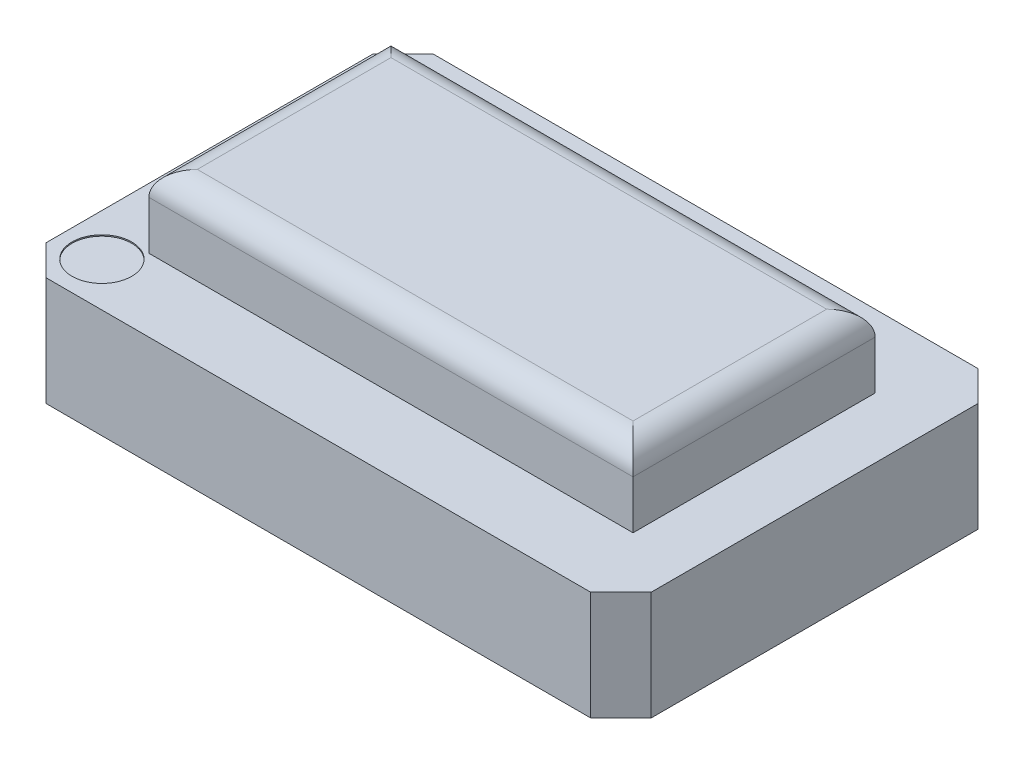
ISO-10303-21;
HEADER;
FILE_DESCRIPTION(('STEP AP214'),'2;1');
FILE_NAME('part.step','',(''),(''),'','','');
FILE_SCHEMA(('AUTOMOTIVE_DESIGN { 1 0 10303 214 1 1 1 1 }'));
ENDSEC;
DATA;
#1=APPLICATION_CONTEXT('core data for automotive mechanical design processes');
#2=APPLICATION_PROTOCOL_DEFINITION('international standard','automotive_design',2000,#1);
#3=PRODUCT_CONTEXT('',#1,'mechanical');
#4=PRODUCT('Part','Part','',(#3));
#5=PRODUCT_RELATED_PRODUCT_CATEGORY('part','',(#4));
#6=PRODUCT_DEFINITION_FORMATION('','',#4);
#7=PRODUCT_DEFINITION_CONTEXT('part definition',#1,'design');
#8=PRODUCT_DEFINITION('design','',#6,#7);
#9=PRODUCT_DEFINITION_SHAPE('','',#8);
#10=(LENGTH_UNIT() NAMED_UNIT(*) SI_UNIT(.MILLI.,.METRE.));
#11=(NAMED_UNIT(*) PLANE_ANGLE_UNIT() SI_UNIT($,.RADIAN.));
#12=(NAMED_UNIT(*) SI_UNIT($,.STERADIAN.) SOLID_ANGLE_UNIT());
#13=UNCERTAINTY_MEASURE_WITH_UNIT(LENGTH_MEASURE(1.E-05),#10,'distance_accuracy_value','');
#14=(GEOMETRIC_REPRESENTATION_CONTEXT(3) GLOBAL_UNCERTAINTY_ASSIGNED_CONTEXT((#13)) GLOBAL_UNIT_ASSIGNED_CONTEXT((#10,
#11,#12)) REPRESENTATION_CONTEXT('',''));
#15=CARTESIAN_POINT('',(0.,0.,0.));
#16=DIRECTION('',(0.,0.,1.));
#17=DIRECTION('',(1.,0.,0.));
#18=AXIS2_PLACEMENT_3D('',#15,#16,#17);
#19=CARTESIAN_POINT('',(-2.5,1.5,1.6));
#20=DIRECTION('',(0.,1.,0.));
#21=DIRECTION('',(0.,0.,1.));
#22=AXIS2_PLACEMENT_3D('',#19,#20,#21);
#23=PLANE('',#22);
#24=DIRECTION('',(1.,0.,0.));
#25=VECTOR('',#24,1.);
#26=CARTESIAN_POINT('',(-2.5,1.5,0.8));
#27=LINE('',#26,#25);
#28=CARTESIAN_POINT('',(1.8,1.5,0.8));
#29=VERTEX_POINT('',#28);
#30=CARTESIAN_POINT('',(-1.8,1.5,0.8));
#31=VERTEX_POINT('',#30);
#32=EDGE_CURVE('E178',#29,#31,#27,.F.);
#33=ORIENTED_EDGE('',*,*,#32,.F.);
#34=DIRECTION('',(0.,0.,-1.));
#35=VECTOR('',#34,1.);
#36=CARTESIAN_POINT('',(1.8,1.5,1.6));
#37=LINE('',#36,#35);
#38=CARTESIAN_POINT('',(1.8,1.5,-0.800000000000001));
#39=VERTEX_POINT('',#38);
#40=EDGE_CURVE('E142',#39,#29,#37,.F.);
#41=ORIENTED_EDGE('',*,*,#40,.F.);
#42=DIRECTION('',(-1.,0.,0.));
#43=VECTOR('',#42,1.);
#44=CARTESIAN_POINT('',(-2.5,1.5,-0.8));
#45=LINE('',#44,#43);
#46=CARTESIAN_POINT('',(-1.8,1.5,-0.8));
#47=VERTEX_POINT('',#46);
#48=EDGE_CURVE('E139',#47,#39,#45,.F.);
#49=ORIENTED_EDGE('',*,*,#48,.F.);
#50=DIRECTION('',(0.,0.,1.));
#51=VECTOR('',#50,1.);
#52=CARTESIAN_POINT('',(-1.8,1.5,1.6));
#53=LINE('',#52,#51);
#54=EDGE_CURVE('E168',#47,#31,#53,.T.);
#55=ORIENTED_EDGE('',*,*,#54,.T.);
#56=EDGE_LOOP('',(#33,#41,#49,#55));
#57=FACE_BOUND('',#56,.T.);
#58=ADVANCED_FACE('F16',(#57),#23,.T.);
#59=CARTESIAN_POINT('',(-2.15218636250114,0.89,1.2360818666366));
#60=DIRECTION('',(0.,1.,0.));
#61=DIRECTION('',(0.,0.,1.));
#62=AXIS2_PLACEMENT_3D('',#59,#60,#61);
#63=PLANE('',#62);
#64=CARTESIAN_POINT('',(-2.15218636250114,0.89,1.2360818666366));
#65=DIRECTION('',(0.,1.,0.));
#66=DIRECTION('',(0.,0.,1.));
#67=AXIS2_PLACEMENT_3D('',#64,#65,#66);
#68=CIRCLE('',#67,0.246495858810898);
#69=CARTESIAN_POINT('',(-2.15218636250114,0.89,1.4825777254475));
#70=VERTEX_POINT('',#69);
#71=EDGE_CURVE('E125',#70,#70,#68,.T.);
#72=ORIENTED_EDGE('',*,*,#71,.T.);
#73=EDGE_LOOP('',(#72));
#74=FACE_BOUND('',#73,.T.);
#75=ADVANCED_FACE('F343',(#74),#63,.T.);
#76=CARTESIAN_POINT('',(-2.5,1.3,-0.8));
#77=DIRECTION('',(-1.,0.,0.));
#78=DIRECTION('',(0.,0.,1.));
#79=AXIS2_PLACEMENT_3D('',#76,#77,#78);
#80=CYLINDRICAL_SURFACE('',#79,0.2);
#81=CARTESIAN_POINT('',(-1.8,1.3,-0.8));
#82=DIRECTION('',(-0.707106781186547,0.,0.707106781186548));
#83=DIRECTION('',(0.707106781186548,0.,0.707106781186547));
#84=AXIS2_PLACEMENT_3D('',#81,#82,#83);
#85=ELLIPSE('',#84,0.282842712474619,0.2);
#86=CARTESIAN_POINT('',(-2.,1.3,-1.));
#87=VERTEX_POINT('',#86);
#88=EDGE_CURVE('E177',#47,#87,#85,.T.);
#89=ORIENTED_EDGE('',*,*,#88,.F.);
#90=ORIENTED_EDGE('',*,*,#48,.T.);
#91=CARTESIAN_POINT('',(1.8,1.3,-0.8));
#92=DIRECTION('',(-0.707106781186548,0.,-0.707106781186547));
#93=DIRECTION('',(0.707106781186547,0.,-0.707106781186548));
#94=AXIS2_PLACEMENT_3D('',#91,#92,#93);
#95=ELLIPSE('',#94,0.282842712474619,0.2);
#96=CARTESIAN_POINT('',(2.,1.3,-1.));
#97=VERTEX_POINT('',#96);
#98=EDGE_CURVE('E19',#97,#39,#95,.F.);
#99=ORIENTED_EDGE('',*,*,#98,.F.);
#100=DIRECTION('',(-1.,0.,0.));
#101=VECTOR('',#100,1.);
#102=CARTESIAN_POINT('',(-2.,1.3,-1.));
#103=LINE('',#102,#101);
#104=EDGE_CURVE('E115',#87,#97,#103,.F.);
#105=ORIENTED_EDGE('',*,*,#104,.F.);
#106=EDGE_LOOP('',(#89,#90,#99,#105));
#107=FACE_BOUND('',#106,.T.);
#108=ADVANCED_FACE('F137',(#107),#80,.T.);
#109=CARTESIAN_POINT('',(1.8,1.3,1.6));
#110=DIRECTION('',(0.,0.,-1.));
#111=DIRECTION('',(-1.,0.,0.));
#112=AXIS2_PLACEMENT_3D('',#109,#110,#111);
#113=CYLINDRICAL_SURFACE('',#112,0.2);
#114=ORIENTED_EDGE('',*,*,#98,.T.);
#115=ORIENTED_EDGE('',*,*,#40,.T.);
#116=CARTESIAN_POINT('',(1.8,1.3,0.8));
#117=DIRECTION('',(0.707106781186547,0.,-0.707106781186548));
#118=DIRECTION('',(0.707106781186548,0.,0.707106781186547));
#119=AXIS2_PLACEMENT_3D('',#116,#117,#118);
#120=ELLIPSE('',#119,0.282842712474619,0.2);
#121=CARTESIAN_POINT('',(2.,1.3,1.));
#122=VERTEX_POINT('',#121);
#123=EDGE_CURVE('E146',#122,#29,#120,.F.);
#124=ORIENTED_EDGE('',*,*,#123,.F.);
#125=DIRECTION('',(0.,0.,-1.));
#126=VECTOR('',#125,1.);
#127=CARTESIAN_POINT('',(2.,1.3,-1.));
#128=LINE('',#127,#126);
#129=EDGE_CURVE('E131',#97,#122,#128,.F.);
#130=ORIENTED_EDGE('',*,*,#129,.F.);
#131=EDGE_LOOP('',(#114,#115,#124,#130));
#132=FACE_BOUND('',#131,.T.);
#133=ADVANCED_FACE('F144',(#132),#113,.T.);
#134=CARTESIAN_POINT('',(-2.5,1.3,0.8));
#135=DIRECTION('',(1.,0.,0.));
#136=DIRECTION('',(0.,0.,-1.));
#137=AXIS2_PLACEMENT_3D('',#134,#135,#136);
#138=CYLINDRICAL_SURFACE('',#137,0.2);
#139=CARTESIAN_POINT('',(-1.8,1.3,0.8));
#140=DIRECTION('',(0.707106781186548,0.,0.707106781186547));
#141=DIRECTION('',(-0.707106781186547,0.,0.707106781186548));
#142=AXIS2_PLACEMENT_3D('',#139,#140,#141);
#143=ELLIPSE('',#142,0.282842712474619,0.2);
#144=CARTESIAN_POINT('',(-2.,1.3,1.));
#145=VERTEX_POINT('',#144);
#146=EDGE_CURVE('E174',#145,#31,#143,.F.);
#147=ORIENTED_EDGE('',*,*,#146,.F.);
#148=DIRECTION('',(1.,0.,0.));
#149=VECTOR('',#148,1.);
#150=CARTESIAN_POINT('',(-2.,1.3,1.));
#151=LINE('',#150,#149);
#152=EDGE_CURVE('E150',#122,#145,#151,.F.);
#153=ORIENTED_EDGE('',*,*,#152,.F.);
#154=ORIENTED_EDGE('',*,*,#123,.T.);
#155=ORIENTED_EDGE('',*,*,#32,.T.);
#156=EDGE_LOOP('',(#147,#153,#154,#155));
#157=FACE_BOUND('',#156,.T.);
#158=ADVANCED_FACE('F336',(#157),#138,.T.);
#159=CARTESIAN_POINT('',(-1.8,1.3,1.6));
#160=DIRECTION('',(0.,0.,1.));
#161=DIRECTION('',(1.,0.,0.));
#162=AXIS2_PLACEMENT_3D('',#159,#160,#161);
#163=CYLINDRICAL_SURFACE('',#162,0.2);
#164=ORIENTED_EDGE('',*,*,#146,.T.);
#165=ORIENTED_EDGE('',*,*,#54,.F.);
#166=ORIENTED_EDGE('',*,*,#88,.T.);
#167=DIRECTION('',(0.,0.,1.));
#168=VECTOR('',#167,1.);
#169=CARTESIAN_POINT('',(-2.,1.3,-1.));
#170=LINE('',#169,#168);
#171=EDGE_CURVE('E196',#145,#87,#170,.F.);
#172=ORIENTED_EDGE('',*,*,#171,.F.);
#173=EDGE_LOOP('',(#164,#165,#166,#172));
#174=FACE_BOUND('',#173,.T.);
#175=ADVANCED_FACE('F332',(#174),#163,.T.);
#176=CARTESIAN_POINT('',(-2.15218636250114,0.89,1.2360818666366));
#177=DIRECTION('',(0.,1.,0.));
#178=DIRECTION('',(0.,0.,1.));
#179=AXIS2_PLACEMENT_3D('',#176,#177,#178);
#180=CYLINDRICAL_SURFACE('',#179,0.246495858810898);
#181=CARTESIAN_POINT('',(-2.15218636250114,0.9,1.2360818666366));
#182=DIRECTION('',(0.,1.,0.));
#183=DIRECTION('',(0.,0.,1.));
#184=AXIS2_PLACEMENT_3D('',#181,#182,#183);
#185=CIRCLE('',#184,0.246495858810898);
#186=CARTESIAN_POINT('',(-2.15218636250114,0.9,1.4825777254475));
#187=VERTEX_POINT('',#186);
#188=EDGE_CURVE('E164',#187,#187,#185,.F.);
#189=ORIENTED_EDGE('',*,*,#188,.F.);
#190=EDGE_LOOP('',(#189));
#191=FACE_BOUND('',#190,.T.);
#192=ORIENTED_EDGE('',*,*,#71,.F.);
#193=EDGE_LOOP('',(#192));
#194=FACE_BOUND('',#193,.T.);
#195=ADVANCED_FACE('F329',(#191,#194),#180,.F.);
#196=CARTESIAN_POINT('',(-2.,0.9,-1.));
#197=DIRECTION('',(0.,0.,-1.));
#198=DIRECTION('',(-1.,0.,0.));
#199=AXIS2_PLACEMENT_3D('',#196,#197,#198);
#200=PLANE('',#199);
#201=DIRECTION('',(0.,1.,0.));
#202=VECTOR('',#201,1.);
#203=CARTESIAN_POINT('',(2.,0.9,-1.));
#204=LINE('',#203,#202);
#205=CARTESIAN_POINT('',(2.,0.9,-1.));
#206=VERTEX_POINT('',#205);
#207=EDGE_CURVE('E119',#206,#97,#204,.T.);
#208=ORIENTED_EDGE('',*,*,#207,.F.);
#209=DIRECTION('',(1.,0.,0.));
#210=VECTOR('',#209,1.);
#211=CARTESIAN_POINT('',(0.,0.9,-1.));
#212=LINE('',#211,#210);
#213=CARTESIAN_POINT('',(-2.,0.9,-1.));
#214=VERTEX_POINT('',#213);
#215=EDGE_CURVE('E157',#214,#206,#212,.T.);
#216=ORIENTED_EDGE('',*,*,#215,.F.);
#217=DIRECTION('',(0.,1.,0.));
#218=VECTOR('',#217,1.);
#219=CARTESIAN_POINT('',(-2.,0.9,-1.));
#220=LINE('',#219,#218);
#221=EDGE_CURVE('E121',#87,#214,#220,.F.);
#222=ORIENTED_EDGE('',*,*,#221,.F.);
#223=ORIENTED_EDGE('',*,*,#104,.T.);
#224=EDGE_LOOP('',(#208,#216,#222,#223));
#225=FACE_BOUND('',#224,.T.);
#226=ADVANCED_FACE('F117',(#225),#200,.T.);
#227=CARTESIAN_POINT('',(2.,0.9,-1.));
#228=DIRECTION('',(1.,0.,0.));
#229=DIRECTION('',(0.,0.,-1.));
#230=AXIS2_PLACEMENT_3D('',#227,#228,#229);
#231=PLANE('',#230);
#232=DIRECTION('',(0.,1.,0.));
#233=VECTOR('',#232,1.);
#234=CARTESIAN_POINT('',(2.,0.9,1.));
#235=LINE('',#234,#233);
#236=CARTESIAN_POINT('',(2.,0.9,1.));
#237=VERTEX_POINT('',#236);
#238=EDGE_CURVE('E148',#237,#122,#235,.T.);
#239=ORIENTED_EDGE('',*,*,#238,.F.);
#240=DIRECTION('',(0.,0.,1.));
#241=VECTOR('',#240,1.);
#242=CARTESIAN_POINT('',(2.,0.9,0.));
#243=LINE('',#242,#241);
#244=EDGE_CURVE('E133',#206,#237,#243,.T.);
#245=ORIENTED_EDGE('',*,*,#244,.F.);
#246=ORIENTED_EDGE('',*,*,#207,.T.);
#247=ORIENTED_EDGE('',*,*,#129,.T.);
#248=EDGE_LOOP('',(#239,#245,#246,#247));
#249=FACE_BOUND('',#248,.T.);
#250=ADVANCED_FACE('F129',(#249),#231,.T.);
#251=CARTESIAN_POINT('',(-2.,0.9,1.));
#252=DIRECTION('',(0.,0.,1.));
#253=DIRECTION('',(1.,0.,0.));
#254=AXIS2_PLACEMENT_3D('',#251,#252,#253);
#255=PLANE('',#254);
#256=DIRECTION('',(0.,1.,0.));
#257=VECTOR('',#256,1.);
#258=CARTESIAN_POINT('',(-2.,0.9,1.));
#259=LINE('',#258,#257);
#260=CARTESIAN_POINT('',(-2.,0.9,1.));
#261=VERTEX_POINT('',#260);
#262=EDGE_CURVE('E195',#261,#145,#259,.T.);
#263=ORIENTED_EDGE('',*,*,#262,.F.);
#264=DIRECTION('',(1.,0.,0.));
#265=VECTOR('',#264,1.);
#266=CARTESIAN_POINT('',(0.,0.9,1.));
#267=LINE('',#266,#265);
#268=EDGE_CURVE('E156',#237,#261,#267,.F.);
#269=ORIENTED_EDGE('',*,*,#268,.F.);
#270=ORIENTED_EDGE('',*,*,#238,.T.);
#271=ORIENTED_EDGE('',*,*,#152,.T.);
#272=EDGE_LOOP('',(#263,#269,#270,#271));
#273=FACE_BOUND('',#272,.T.);
#274=ADVANCED_FACE('F320',(#273),#255,.T.);
#275=CARTESIAN_POINT('',(-2.,0.9,-1.));
#276=DIRECTION('',(-1.,0.,0.));
#277=DIRECTION('',(0.,0.,1.));
#278=AXIS2_PLACEMENT_3D('',#275,#276,#277);
#279=PLANE('',#278);
#280=ORIENTED_EDGE('',*,*,#221,.T.);
#281=DIRECTION('',(0.,0.,1.));
#282=VECTOR('',#281,1.);
#283=CARTESIAN_POINT('',(-2.,0.9,0.));
#284=LINE('',#283,#282);
#285=EDGE_CURVE('E187',#261,#214,#284,.F.);
#286=ORIENTED_EDGE('',*,*,#285,.F.);
#287=ORIENTED_EDGE('',*,*,#262,.T.);
#288=ORIENTED_EDGE('',*,*,#171,.T.);
#289=EDGE_LOOP('',(#280,#286,#287,#288));
#290=FACE_BOUND('',#289,.T.);
#291=ADVANCED_FACE('F316',(#290),#279,.T.);
#292=CARTESIAN_POINT('',(0.,0.9,0.));
#293=DIRECTION('',(0.,1.,0.));
#294=DIRECTION('',(0.,0.,1.));
#295=AXIS2_PLACEMENT_3D('',#292,#293,#294);
#296=PLANE('',#295);
#297=ORIENTED_EDGE('',*,*,#268,.T.);
#298=ORIENTED_EDGE('',*,*,#285,.T.);
#299=ORIENTED_EDGE('',*,*,#215,.T.);
#300=ORIENTED_EDGE('',*,*,#244,.T.);
#301=EDGE_LOOP('',(#297,#298,#299,#300));
#302=FACE_BOUND('',#301,.T.);
#303=DIRECTION('',(1.,0.,0.));
#304=VECTOR('',#303,1.);
#305=CARTESIAN_POINT('',(-2.5,0.9,-1.6));
#306=LINE('',#305,#304);
#307=CARTESIAN_POINT('',(2.25,0.9,-1.6));
#308=VERTEX_POINT('',#307);
#309=CARTESIAN_POINT('',(-2.25,0.9,-1.6));
#310=VERTEX_POINT('',#309);
#311=EDGE_CURVE('E228',#308,#310,#306,.F.);
#312=ORIENTED_EDGE('',*,*,#311,.T.);
#313=DIRECTION('',(0.707106781186549,0.,-0.707106781186546));
#314=VECTOR('',#313,1.);
#315=CARTESIAN_POINT('',(-2.5,0.9,-1.35));
#316=LINE('',#315,#314);
#317=CARTESIAN_POINT('',(-2.5,0.9,-1.35));
#318=VERTEX_POINT('',#317);
#319=EDGE_CURVE('E233',#310,#318,#316,.F.);
#320=ORIENTED_EDGE('',*,*,#319,.T.);
#321=DIRECTION('',(0.,0.,-1.));
#322=VECTOR('',#321,1.);
#323=CARTESIAN_POINT('',(-2.5,0.9,-1.6));
#324=LINE('',#323,#322);
#325=CARTESIAN_POINT('',(-2.5,0.9,1.35));
#326=VERTEX_POINT('',#325);
#327=EDGE_CURVE('E239',#318,#326,#324,.F.);
#328=ORIENTED_EDGE('',*,*,#327,.T.);
#329=DIRECTION('',(-0.707106781186546,0.,-0.707106781186549));
#330=VECTOR('',#329,1.);
#331=CARTESIAN_POINT('',(-2.25,0.9,1.6));
#332=LINE('',#331,#330);
#333=CARTESIAN_POINT('',(-2.25,0.9,1.6));
#334=VERTEX_POINT('',#333);
#335=EDGE_CURVE('E190',#326,#334,#332,.F.);
#336=ORIENTED_EDGE('',*,*,#335,.T.);
#337=DIRECTION('',(-1.,0.,0.));
#338=VECTOR('',#337,1.);
#339=CARTESIAN_POINT('',(-2.5,0.9,1.6));
#340=LINE('',#339,#338);
#341=CARTESIAN_POINT('',(2.25,0.9,1.6));
#342=VERTEX_POINT('',#341);
#343=EDGE_CURVE('E208',#334,#342,#340,.F.);
#344=ORIENTED_EDGE('',*,*,#343,.T.);
#345=DIRECTION('',(-0.70710678118655,0.,0.707106781186545));
#346=VECTOR('',#345,1.);
#347=CARTESIAN_POINT('',(2.5,0.9,1.35));
#348=LINE('',#347,#346);
#349=CARTESIAN_POINT('',(2.5,0.9,1.35));
#350=VERTEX_POINT('',#349);
#351=EDGE_CURVE('E213',#342,#350,#348,.F.);
#352=ORIENTED_EDGE('',*,*,#351,.T.);
#353=DIRECTION('',(0.,0.,1.));
#354=VECTOR('',#353,1.);
#355=CARTESIAN_POINT('',(2.5,0.9,-1.6));
#356=LINE('',#355,#354);
#357=CARTESIAN_POINT('',(2.5,0.9,-1.35));
#358=VERTEX_POINT('',#357);
#359=EDGE_CURVE('E218',#350,#358,#356,.F.);
#360=ORIENTED_EDGE('',*,*,#359,.T.);
#361=DIRECTION('',(0.707106781186547,0.,0.707106781186548));
#362=VECTOR('',#361,1.);
#363=CARTESIAN_POINT('',(2.25,0.9,-1.6));
#364=LINE('',#363,#362);
#365=EDGE_CURVE('E223',#358,#308,#364,.F.);
#366=ORIENTED_EDGE('',*,*,#365,.T.);
#367=EDGE_LOOP('',(#312,#320,#328,#336,#344,#352,#360,#366));
#368=FACE_BOUND('',#367,.T.);
#369=ORIENTED_EDGE('',*,*,#188,.T.);
#370=EDGE_LOOP('',(#369));
#371=FACE_BOUND('',#370,.T.);
#372=ADVANCED_FACE('F313',(#302,#368,#371),#296,.T.);
#373=CARTESIAN_POINT('',(-2.25,1.5,1.6));
#374=DIRECTION('',(0.707106781186549,0.,-0.707106781186546));
#375=DIRECTION('',(-0.707106781186546,0.,-0.707106781186549));
#376=AXIS2_PLACEMENT_3D('',#373,#374,#375);
#377=PLANE('',#376);
#378=ORIENTED_EDGE('',*,*,#335,.F.);
#379=DIRECTION('',(0.,1.,0.));
#380=VECTOR('',#379,1.);
#381=CARTESIAN_POINT('',(-2.5,1.5,1.35));
#382=LINE('',#381,#380);
#383=CARTESIAN_POINT('',(-2.5,0.,1.35));
#384=VERTEX_POINT('',#383);
#385=EDGE_CURVE('E235',#326,#384,#382,.F.);
#386=ORIENTED_EDGE('',*,*,#385,.T.);
#387=DIRECTION('',(0.707106781186547,0.,0.707106781186548));
#388=VECTOR('',#387,1.);
#389=CARTESIAN_POINT('',(-2.5,0.,1.35));
#390=LINE('',#389,#388);
#391=CARTESIAN_POINT('',(-2.25,0.,1.6));
#392=VERTEX_POINT('',#391);
#393=EDGE_CURVE('E242',#384,#392,#390,.T.);
#394=ORIENTED_EDGE('',*,*,#393,.T.);
#395=DIRECTION('',(0.,1.,0.));
#396=VECTOR('',#395,1.);
#397=CARTESIAN_POINT('',(-2.25,1.5,1.6));
#398=LINE('',#397,#396);
#399=EDGE_CURVE('E205',#392,#334,#398,.T.);
#400=ORIENTED_EDGE('',*,*,#399,.T.);
#401=EDGE_LOOP('',(#378,#386,#394,#400));
#402=FACE_BOUND('',#401,.T.);
#403=ADVANCED_FACE('F288',(#402),#377,.F.);
#404=CARTESIAN_POINT('',(-2.5,1.5,1.6));
#405=DIRECTION('',(0.,0.,-1.));
#406=DIRECTION('',(-1.,0.,0.));
#407=AXIS2_PLACEMENT_3D('',#404,#405,#406);
#408=PLANE('',#407);
#409=ORIENTED_EDGE('',*,*,#399,.F.);
#410=DIRECTION('',(1.,0.,0.));
#411=VECTOR('',#410,1.);
#412=CARTESIAN_POINT('',(-2.5,0.,1.6));
#413=LINE('',#412,#411);
#414=CARTESIAN_POINT('',(2.25,0.,1.6));
#415=VERTEX_POINT('',#414);
#416=EDGE_CURVE('E245',#392,#415,#413,.T.);
#417=ORIENTED_EDGE('',*,*,#416,.T.);
#418=DIRECTION('',(0.,1.,0.));
#419=VECTOR('',#418,1.);
#420=CARTESIAN_POINT('',(2.25,1.5,1.6));
#421=LINE('',#420,#419);
#422=EDGE_CURVE('E210',#415,#342,#421,.T.);
#423=ORIENTED_EDGE('',*,*,#422,.T.);
#424=ORIENTED_EDGE('',*,*,#343,.F.);
#425=EDGE_LOOP('',(#409,#417,#423,#424));
#426=FACE_BOUND('',#425,.T.);
#427=ADVANCED_FACE('F285',(#426),#408,.F.);
#428=CARTESIAN_POINT('',(2.5,1.5,1.35));
#429=DIRECTION('',(-0.707106781186545,0.,-0.70710678118655));
#430=DIRECTION('',(-0.70710678118655,0.,0.707106781186545));
#431=AXIS2_PLACEMENT_3D('',#428,#429,#430);
#432=PLANE('',#431);
#433=ORIENTED_EDGE('',*,*,#351,.F.);
#434=ORIENTED_EDGE('',*,*,#422,.F.);
#435=DIRECTION('',(0.707106781186547,0.,-0.707106781186548));
#436=VECTOR('',#435,1.);
#437=CARTESIAN_POINT('',(2.25,0.,1.6));
#438=LINE('',#437,#436);
#439=CARTESIAN_POINT('',(2.5,0.,1.35));
#440=VERTEX_POINT('',#439);
#441=EDGE_CURVE('E248',#415,#440,#438,.T.);
#442=ORIENTED_EDGE('',*,*,#441,.T.);
#443=DIRECTION('',(0.,1.,0.));
#444=VECTOR('',#443,1.);
#445=CARTESIAN_POINT('',(2.5,1.5,1.35));
#446=LINE('',#445,#444);
#447=EDGE_CURVE('E215',#440,#350,#446,.T.);
#448=ORIENTED_EDGE('',*,*,#447,.T.);
#449=EDGE_LOOP('',(#433,#434,#442,#448));
#450=FACE_BOUND('',#449,.T.);
#451=ADVANCED_FACE('F282',(#450),#432,.F.);
#452=CARTESIAN_POINT('',(2.5,1.5,-1.6));
#453=DIRECTION('',(-1.,0.,0.));
#454=DIRECTION('',(0.,0.,1.));
#455=AXIS2_PLACEMENT_3D('',#452,#453,#454);
#456=PLANE('',#455);
#457=ORIENTED_EDGE('',*,*,#447,.F.);
#458=DIRECTION('',(0.,0.,1.));
#459=VECTOR('',#458,1.);
#460=CARTESIAN_POINT('',(2.5,0.,1.6));
#461=LINE('',#460,#459);
#462=CARTESIAN_POINT('',(2.5,0.,-1.35));
#463=VERTEX_POINT('',#462);
#464=EDGE_CURVE('E251',#440,#463,#461,.F.);
#465=ORIENTED_EDGE('',*,*,#464,.T.);
#466=DIRECTION('',(0.,1.,0.));
#467=VECTOR('',#466,1.);
#468=CARTESIAN_POINT('',(2.5,1.5,-1.35));
#469=LINE('',#468,#467);
#470=EDGE_CURVE('E220',#463,#358,#469,.T.);
#471=ORIENTED_EDGE('',*,*,#470,.T.);
#472=ORIENTED_EDGE('',*,*,#359,.F.);
#473=EDGE_LOOP('',(#457,#465,#471,#472));
#474=FACE_BOUND('',#473,.T.);
#475=ADVANCED_FACE('F278',(#474),#456,.F.);
#476=CARTESIAN_POINT('',(2.25,1.5,-1.6));
#477=DIRECTION('',(-0.707106781186548,0.,0.707106781186547));
#478=DIRECTION('',(0.707106781186547,0.,0.707106781186548));
#479=AXIS2_PLACEMENT_3D('',#476,#477,#478);
#480=PLANE('',#479);
#481=ORIENTED_EDGE('',*,*,#365,.F.);
#482=ORIENTED_EDGE('',*,*,#470,.F.);
#483=DIRECTION('',(-0.707106781186547,0.,-0.707106781186548));
#484=VECTOR('',#483,1.);
#485=CARTESIAN_POINT('',(2.5,0.,-1.35));
#486=LINE('',#485,#484);
#487=CARTESIAN_POINT('',(2.25,0.,-1.6));
#488=VERTEX_POINT('',#487);
#489=EDGE_CURVE('E254',#463,#488,#486,.T.);
#490=ORIENTED_EDGE('',*,*,#489,.T.);
#491=DIRECTION('',(0.,1.,0.));
#492=VECTOR('',#491,1.);
#493=CARTESIAN_POINT('',(2.25,1.5,-1.6));
#494=LINE('',#493,#492);
#495=EDGE_CURVE('E225',#488,#308,#494,.T.);
#496=ORIENTED_EDGE('',*,*,#495,.T.);
#497=EDGE_LOOP('',(#481,#482,#490,#496));
#498=FACE_BOUND('',#497,.T.);
#499=ADVANCED_FACE('F274',(#498),#480,.F.);
#500=CARTESIAN_POINT('',(-2.5,1.5,-1.6));
#501=DIRECTION('',(0.,0.,1.));
#502=DIRECTION('',(1.,0.,0.));
#503=AXIS2_PLACEMENT_3D('',#500,#501,#502);
#504=PLANE('',#503);
#505=ORIENTED_EDGE('',*,*,#495,.F.);
#506=DIRECTION('',(1.,0.,0.));
#507=VECTOR('',#506,1.);
#508=CARTESIAN_POINT('',(-2.5,0.,-1.6));
#509=LINE('',#508,#507);
#510=CARTESIAN_POINT('',(-2.25,0.,-1.6));
#511=VERTEX_POINT('',#510);
#512=EDGE_CURVE('E257',#488,#511,#509,.F.);
#513=ORIENTED_EDGE('',*,*,#512,.T.);
#514=DIRECTION('',(0.,1.,0.));
#515=VECTOR('',#514,1.);
#516=CARTESIAN_POINT('',(-2.25,1.5,-1.6));
#517=LINE('',#516,#515);
#518=EDGE_CURVE('E230',#511,#310,#517,.T.);
#519=ORIENTED_EDGE('',*,*,#518,.T.);
#520=ORIENTED_EDGE('',*,*,#311,.F.);
#521=EDGE_LOOP('',(#505,#513,#519,#520));
#522=FACE_BOUND('',#521,.T.);
#523=ADVANCED_FACE('F270',(#522),#504,.F.);
#524=CARTESIAN_POINT('',(-2.5,1.5,-1.35));
#525=DIRECTION('',(0.707106781186546,0.,0.707106781186549));
#526=DIRECTION('',(0.707106781186549,0.,-0.707106781186546));
#527=AXIS2_PLACEMENT_3D('',#524,#525,#526);
#528=PLANE('',#527);
#529=ORIENTED_EDGE('',*,*,#319,.F.);
#530=ORIENTED_EDGE('',*,*,#518,.F.);
#531=DIRECTION('',(-0.707106781186548,0.,0.707106781186548));
#532=VECTOR('',#531,1.);
#533=CARTESIAN_POINT('',(-2.25,0.,-1.6));
#534=LINE('',#533,#532);
#535=CARTESIAN_POINT('',(-2.5,0.,-1.35));
#536=VERTEX_POINT('',#535);
#537=EDGE_CURVE('E25',#511,#536,#534,.T.);
#538=ORIENTED_EDGE('',*,*,#537,.T.);
#539=DIRECTION('',(0.,1.,0.));
#540=VECTOR('',#539,1.);
#541=CARTESIAN_POINT('',(-2.5,1.5,-1.35));
#542=LINE('',#541,#540);
#543=EDGE_CURVE('E33',#536,#318,#542,.T.);
#544=ORIENTED_EDGE('',*,*,#543,.T.);
#545=EDGE_LOOP('',(#529,#530,#538,#544));
#546=FACE_BOUND('',#545,.T.);
#547=ADVANCED_FACE('F264',(#546),#528,.F.);
#548=CARTESIAN_POINT('',(-2.5,1.5,-1.6));
#549=DIRECTION('',(1.,0.,0.));
#550=DIRECTION('',(0.,0.,-1.));
#551=AXIS2_PLACEMENT_3D('',#548,#549,#550);
#552=PLANE('',#551);
#553=ORIENTED_EDGE('',*,*,#543,.F.);
#554=DIRECTION('',(0.,0.,1.));
#555=VECTOR('',#554,1.);
#556=CARTESIAN_POINT('',(-2.5,0.,1.6));
#557=LINE('',#556,#555);
#558=EDGE_CURVE('E11',#536,#384,#557,.T.);
#559=ORIENTED_EDGE('',*,*,#558,.T.);
#560=ORIENTED_EDGE('',*,*,#385,.F.);
#561=ORIENTED_EDGE('',*,*,#327,.F.);
#562=EDGE_LOOP('',(#553,#559,#560,#561));
#563=FACE_BOUND('',#562,.T.);
#564=ADVANCED_FACE('F290',(#563),#552,.F.);
#565=CARTESIAN_POINT('',(-2.5,0.,1.6));
#566=DIRECTION('',(0.,1.,0.));
#567=DIRECTION('',(0.,0.,1.));
#568=AXIS2_PLACEMENT_3D('',#565,#566,#567);
#569=PLANE('',#568);
#570=ORIENTED_EDGE('',*,*,#537,.F.);
#571=ORIENTED_EDGE('',*,*,#512,.F.);
#572=ORIENTED_EDGE('',*,*,#489,.F.);
#573=ORIENTED_EDGE('',*,*,#464,.F.);
#574=ORIENTED_EDGE('',*,*,#441,.F.);
#575=ORIENTED_EDGE('',*,*,#416,.F.);
#576=ORIENTED_EDGE('',*,*,#393,.F.);
#577=ORIENTED_EDGE('',*,*,#558,.F.);
#578=EDGE_LOOP('',(#570,#571,#572,#573,#574,#575,#576,#577));
#579=FACE_BOUND('',#578,.T.);
#580=ADVANCED_FACE('F267',(#579),#569,.F.);
#581=CLOSED_SHELL('',(#58,#75,#108,#133,#158,#175,#195,#226,#250,#274,#291,#372,#403,#427,#451,
#475,#499,#523,#547,#564,#580));
#582=MANIFOLD_SOLID_BREP('B1',#581);
#583=ADVANCED_BREP_SHAPE_REPRESENTATION('',(#18,#582),#14);
#584=SHAPE_DEFINITION_REPRESENTATION(#9,#583);
ENDSEC;
END-ISO-10303-21;
